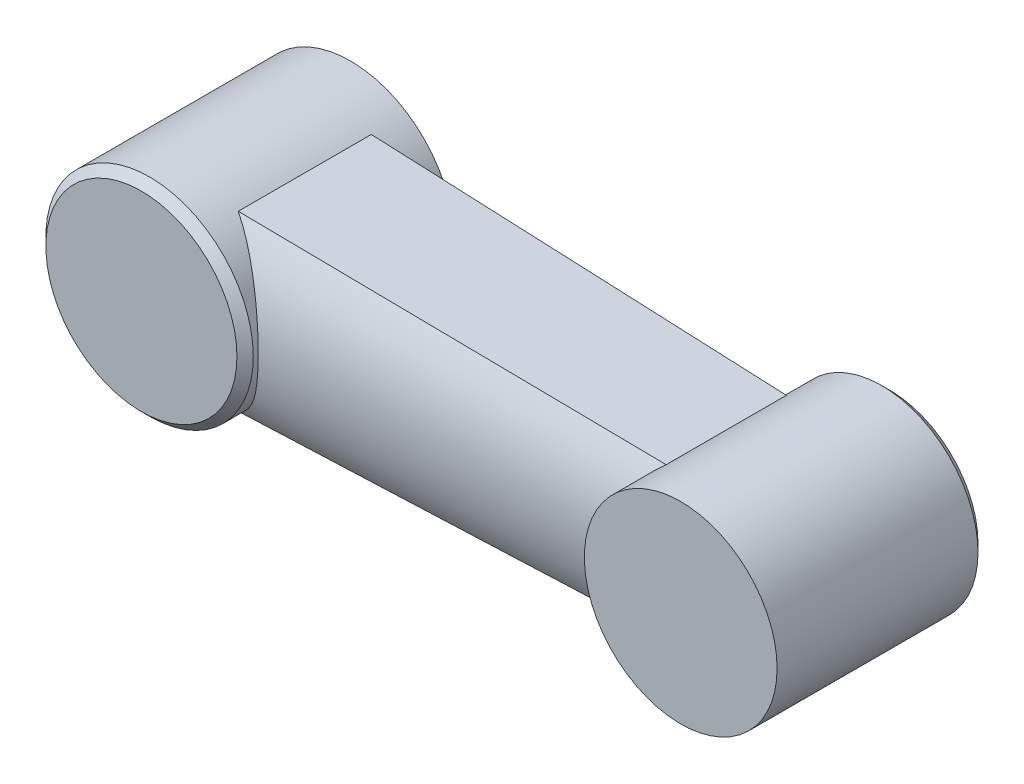
ISO-10303-21;
HEADER;
FILE_DESCRIPTION(('STEP AP214'),'2;1');
FILE_NAME('part.step','',(''),(''),'','','');
FILE_SCHEMA(('AUTOMOTIVE_DESIGN { 1 0 10303 214 1 1 1 1 }'));
ENDSEC;
DATA;
#1=APPLICATION_CONTEXT('core data for automotive mechanical design processes');
#2=APPLICATION_PROTOCOL_DEFINITION('international standard','automotive_design',2000,#1);
#3=PRODUCT_CONTEXT('',#1,'mechanical');
#4=PRODUCT('Part','Part','',(#3));
#5=PRODUCT_RELATED_PRODUCT_CATEGORY('part','',(#4));
#6=PRODUCT_DEFINITION_FORMATION('','',#4);
#7=PRODUCT_DEFINITION_CONTEXT('part definition',#1,'design');
#8=PRODUCT_DEFINITION('design','',#6,#7);
#9=PRODUCT_DEFINITION_SHAPE('','',#8);
#10=(LENGTH_UNIT() NAMED_UNIT(*) SI_UNIT(.MILLI.,.METRE.));
#11=(NAMED_UNIT(*) PLANE_ANGLE_UNIT() SI_UNIT($,.RADIAN.));
#12=(NAMED_UNIT(*) SI_UNIT($,.STERADIAN.) SOLID_ANGLE_UNIT());
#13=UNCERTAINTY_MEASURE_WITH_UNIT(LENGTH_MEASURE(1.E-05),#10,'distance_accuracy_value','');
#14=(GEOMETRIC_REPRESENTATION_CONTEXT(3) GLOBAL_UNCERTAINTY_ASSIGNED_CONTEXT((#13)) GLOBAL_UNIT_ASSIGNED_CONTEXT((#10,
#11,#12)) REPRESENTATION_CONTEXT('',''));
#15=CARTESIAN_POINT('',(0.,0.,0.));
#16=DIRECTION('',(0.,0.,1.));
#17=DIRECTION('',(1.,0.,0.));
#18=AXIS2_PLACEMENT_3D('',#15,#16,#17);
#19=CARTESIAN_POINT('',(0.,0.,-64.));
#20=DIRECTION('',(0.,0.,1.));
#21=DIRECTION('',(1.,0.,0.));
#22=AXIS2_PLACEMENT_3D('',#19,#20,#21);
#23=CYLINDRICAL_SURFACE('',#22,63.5);
#24=CARTESIAN_POINT('',(34.9204791441298,53.035932501884,39.6136534289983));
#25=CARTESIAN_POINT('',(35.6944022457321,52.5263366120522,39.9545585117256));
#26=CARTESIAN_POINT('',(36.4558374355792,52.0007202673648,40.2997799657224));
#27=CARTESIAN_POINT('',(37.953384225097,50.9180230792784,40.9961941182719));
#28=CARTESIAN_POINT('',(38.6894919975638,50.3609375139006,41.3473877073922));
#29=CARTESIAN_POINT('',(40.1358923948207,49.2159612898165,42.0530240157247));
#30=CARTESIAN_POINT('',(40.8461818183182,48.628066832943,42.4074671310783));
#31=CARTESIAN_POINT('',(42.240351755626,47.4220655910807,43.1170402718943));
#32=CARTESIAN_POINT('',(42.9242308312267,46.8039571648921,43.4721703336623));
#33=CARTESIAN_POINT('',(44.2705186839855,45.5327945422843,44.1836196254836));
#34=CARTESIAN_POINT('',(44.9327005849215,44.8794917065392,44.5399240364318));
#35=CARTESIAN_POINT('',(46.2287747746625,43.5432735197613,45.2483179196666));
#36=CARTESIAN_POINT('',(46.8626683351594,42.860359502615,45.6004075809039));
#37=CARTESIAN_POINT('',(48.1013303513337,41.4654310568329,46.2980545066389));
#38=CARTESIAN_POINT('',(48.7060998613074,40.7534176833272,46.6436120073264));
#39=CARTESIAN_POINT('',(49.885582013095,39.3008155912695,47.3259513315572));
#40=CARTESIAN_POINT('',(50.4602931550173,38.5602254499549,47.6627327167584));
#41=CARTESIAN_POINT('',(51.7671230565499,36.7966293591359,48.4370135587281));
#42=CARTESIAN_POINT('',(52.486987566771,35.7625868200861,48.8701899213013));
#43=CARTESIAN_POINT('',(53.8680932645317,33.6463231365426,49.711666019401));
#44=CARTESIAN_POINT('',(54.5293339527788,32.5641015818316,50.1199655430449));
#45=CARTESIAN_POINT('',(55.7900387408964,30.353590750785,50.9066600369545));
#46=CARTESIAN_POINT('',(56.3894987760518,29.2252984501412,51.2850530392084));
#47=CARTESIAN_POINT('',(57.5212239539998,26.9293742529238,52.005760078356));
#48=CARTESIAN_POINT('',(58.0537080044097,25.7618872014115,52.3481910158109));
#49=CARTESIAN_POINT('',(59.0502568765956,23.3874913211638,52.993732445992));
#50=CARTESIAN_POINT('',(59.5143241532075,22.1805839087541,53.2968443494624));
#51=CARTESIAN_POINT('',(60.3704572756633,19.7316956988067,53.8593314616049));
#52=CARTESIAN_POINT('',(60.7625356875299,18.4897210661835,54.1187143027597));
#53=CARTESIAN_POINT('',(61.4302684005686,16.1215713110488,54.5624820901163));
#54=CARTESIAN_POINT('',(61.714153826132,14.9986872151662,54.7520775462024));
#55=CARTESIAN_POINT('',(62.2210427924515,12.7333707527781,55.0916679595512));
#56=CARTESIAN_POINT('',(62.4440498101163,11.5909395066181,55.241665178346));
#57=CARTESIAN_POINT('',(62.8274387168705,9.29097042119799,55.5001048771278));
#58=CARTESIAN_POINT('',(62.9878218290603,8.13343287743358,55.6085481686991));
#59=CARTESIAN_POINT('',(63.2446042459299,5.80839653609666,55.7823981588399));
#60=CARTESIAN_POINT('',(63.341022429846,4.64090078082276,55.8478175558541));
#61=CARTESIAN_POINT('',(63.4691268611473,2.30071551524612,55.9347730550513));
#62=CARTESIAN_POINT('',(63.5008115314218,1.12802587910176,55.9563080880742));
#63=CARTESIAN_POINT('',(63.4991571937612,-1.21715470496937,55.9551835401746));
#64=CARTESIAN_POINT('',(63.4658294096803,-2.38964565224898,55.9325315877641));
#65=CARTESIAN_POINT('',(63.3579910495677,-4.31063448574564,55.8593378030233));
#66=CARTESIAN_POINT('',(63.3024765228745,-5.06077085070067,55.8216709555316));
#67=CARTESIAN_POINT('',(63.1649675931491,-6.55755857953637,55.7284742618857));
#68=CARTESIAN_POINT('',(63.0829720507967,-7.30420979206931,55.6729436471606));
#69=CARTESIAN_POINT('',(62.892804603503,-8.79248851370951,55.5443429087866));
#70=CARTESIAN_POINT('',(62.7846379067425,-9.53411699221496,55.4712762749101));
#71=CARTESIAN_POINT('',(62.54247530455,-11.0113130136815,55.3079947423081));
#72=CARTESIAN_POINT('',(62.4084769904823,-11.7468799847706,55.2177782444768));
#73=CARTESIAN_POINT('',(62.1151386735166,-13.2104664689008,55.0207187131386));
#74=CARTESIAN_POINT('',(61.9558060213724,-13.9384881061527,54.9138805026117));
#75=CARTESIAN_POINT('',(61.6122579762266,-15.3861356748058,54.6841148249538));
#76=CARTESIAN_POINT('',(61.4280402933058,-16.1057608269344,54.5611858771862));
#77=CARTESIAN_POINT('',(61.0352910060898,-17.5354711222982,54.2998831761505));
#78=CARTESIAN_POINT('',(60.8267607142465,-18.2455567781921,54.1615102566014));
#79=CARTESIAN_POINT('',(60.3859721307033,-19.655279575356,53.8700097244628));
#80=CARTESIAN_POINT('',(60.1537116811185,-20.3549157597686,53.7168807701158));
#81=CARTESIAN_POINT('',(59.4141343634581,-22.4598782180801,53.2311245547272));
#82=CARTESIAN_POINT('',(58.8705228075032,-23.8476226491448,52.8764751067773));
#83=CARTESIAN_POINT('',(57.6932450802826,-26.5695174503662,52.1160141959357));
#84=CARTESIAN_POINT('',(57.0595784478214,-27.9036675460074,51.7102024710298));
#85=CARTESIAN_POINT('',(55.7069673807711,-30.5147040769169,50.8542788136301));
#86=CARTESIAN_POINT('',(54.9879523552836,-31.7915418899121,50.4041302636645));
#87=CARTESIAN_POINT('',(53.4702179213507,-34.2828502773657,49.4674248747775));
#88=CARTESIAN_POINT('',(52.6714958500793,-35.4973187661565,48.9808668196359));
#89=CARTESIAN_POINT('',(50.8755490257034,-38.0353618794208,47.905218723411));
#90=CARTESIAN_POINT('',(49.8664229791161,-39.3486029834299,47.3115916164971));
#91=CARTESIAN_POINT('',(47.7551658444119,-41.885782567689,46.0987166871643));
#92=CARTESIAN_POINT('',(46.6530142255047,-43.1097012227068,45.4794632244476));
#93=CARTESIAN_POINT('',(44.3622478691862,-45.4635569828643,44.2289109141248));
#94=CARTESIAN_POINT('',(43.1737431880563,-46.593609912694,43.5976281297309));
#95=CARTESIAN_POINT('',(40.7132426976145,-48.7582311812576,42.3358257344886));
#96=CARTESIAN_POINT('',(39.4412873533656,-49.7928452210454,41.7053059025513));
#97=CARTESIAN_POINT('',(37.6067744813492,-51.1703743191839,40.8344472946498));
#98=CARTESIAN_POINT('',(37.0780303012779,-51.5548051345856,40.5876816459704));
#99=CARTESIAN_POINT('',(36.0084380645576,-52.3074504864124,40.0977796111331));
#100=CARTESIAN_POINT('',(35.4676034432465,-52.6756817931097,39.8546396526085));
#101=CARTESIAN_POINT('',(34.9204791441297,-53.0359325018841,39.6136534289983));
#102=B_SPLINE_CURVE_WITH_KNOTS('',3,(#24,#25,#26,#27,#28,#29,#30,#31,#32,#33,#34,#35,#36,#37,
#38,#39,#40,#41,#42,#43,#44,#45,#46,#47,#48,#49,#50,#51,#52,#53,#54,#55,#56,#57,#58,#59,#60,#61,
#62,#63,#64,#65,#66,#67,#68,#69,#70,#71,#72,#73,#74,#75,#76,#77,#78,#79,#80,#81,#82,#83,#84,#85,
#86,#87,#88,#89,#90,#91,#92,#93,#94,#95,#96,#97,#98,#99,#100,#101),.UNSPECIFIED.,.F.,.F.,(4,2,2,
2,2,2,2,2,2,2,2,2,2,2,2,2,2,2,2,2,2,2,2,2,2,2,2,2,2,2,2,2,2,2,2,2,2,2,4),(0.,2.96179130910863,
5.92402822372926,8.88663119048601,11.8493952627805,14.8368909806684,17.8242522612117,
20.8115053172739,23.7989072932561,27.793469546084,31.7880658168843,35.7829247353502,
39.7643672240742,43.7456668214152,47.7262708005809,51.2448532438437,54.7632346905527,
58.2815474167174,61.7988212510133,65.3161807760589,68.8329331122647,71.0917053695323,
73.3505748212544,75.6089951166956,77.8676260975546,80.1256029289095,82.3837876809059,
84.6418505871747,86.9001190118447,91.4911348475269,96.0821741958438,100.677037562874,
105.272054484957,110.544917455854,115.818947208513,121.086369334502,126.351255910028,
128.447262869353,130.541046297104),.UNSPECIFIED.);
#103=CARTESIAN_POINT('',(34.9204791441298,53.035932501884,39.6136534289983));
#104=VERTEX_POINT('',#103);
#105=CARTESIAN_POINT('',(34.9204791441297,-53.0359325018841,39.6136534289983));
#106=VERTEX_POINT('',#105);
#107=EDGE_CURVE('E115',#104,#106,#102,.T.);
#108=ORIENTED_EDGE('',*,*,#107,.F.);
#109=DIRECTION('',(0.,0.,1.));
#110=VECTOR('',#109,1.);
#111=CARTESIAN_POINT('',(34.9204791441298,53.035932501884,-64.));
#112=LINE('',#111,#110);
#113=CARTESIAN_POINT('',(34.9204791441297,53.0359325018841,-41.825259274656));
#114=VERTEX_POINT('',#113);
#115=EDGE_CURVE('E183',#114,#104,#112,.T.);
#116=ORIENTED_EDGE('',*,*,#115,.F.);
#117=CARTESIAN_POINT('',(34.9204791441297,-53.035932501884,-41.825259274656));
#118=CARTESIAN_POINT('',(35.4329511763315,-52.6985014967848,-42.0146265103923));
#119=CARTESIAN_POINT('',(35.9400059412741,-52.3539966326961,-42.2059169937283));
#120=CARTESIAN_POINT('',(36.9431216705551,-51.65104992522,-42.5916559530003));
#121=CARTESIAN_POINT('',(37.4391828222152,-51.2926083195895,-42.7861043750297));
#122=CARTESIAN_POINT('',(38.9106163521529,-50.1967115336154,-43.3731450594031));
#123=CARTESIAN_POINT('',(39.869287476107,-49.4386523173855,-43.7694508442434));
#124=CARTESIAN_POINT('',(41.7402634827423,-47.8695240724582,-44.5664815151574));
#125=CARTESIAN_POINT('',(42.6525659802537,-47.0584523217289,-44.9672066272704));
#126=CARTESIAN_POINT('',(44.434249173147,-45.3801038911354,-45.7702492719736));
#127=CARTESIAN_POINT('',(45.3033521014658,-44.5125301439949,-46.1725626665485));
#128=CARTESIAN_POINT('',(46.9910205462252,-42.7270754120246,-46.9714284568039));
#129=CARTESIAN_POINT('',(47.809587376756,-41.8091957364726,-47.3679810020785));
#130=CARTESIAN_POINT('',(49.3941260572186,-39.9247512784865,-48.1505134947727));
#131=CARTESIAN_POINT('',(50.1600967533087,-38.9581854287925,-48.5364932101365));
#132=CARTESIAN_POINT('',(51.6385028991067,-36.976293658282,-49.293918859258));
#133=CARTESIAN_POINT('',(52.3508329196351,-35.9608778265998,-49.6653355169379));
#134=CARTESIAN_POINT('',(53.7177541937167,-33.8850585460878,-50.388289993315));
#135=CARTESIAN_POINT('',(54.3723455443608,-32.8246551729114,-50.7398278454393));
#136=CARTESIAN_POINT('',(55.6210447515492,-30.6612022380774,-51.4186270461508));
#137=CARTESIAN_POINT('',(56.2151499680016,-29.5581508178194,-51.7458873349047));
#138=CARTESIAN_POINT('',(57.3385901727929,-27.3149369246483,-52.3711276801021));
#139=CARTESIAN_POINT('',(57.8680756050923,-26.1748687889999,-52.669175415835));
#140=CARTESIAN_POINT('',(58.8609392870564,-23.8584909054211,-53.2328643342909));
#141=CARTESIAN_POINT('',(59.324318888847,-22.6821818993585,-53.4985061798264));
#142=CARTESIAN_POINT('',(60.1820146047915,-20.2973045444015,-53.9936461620778));
#143=CARTESIAN_POINT('',(60.5763384611462,-19.0887398293945,-54.2231483503085));
#144=CARTESIAN_POINT('',(61.2631175599457,-16.7464156556383,-54.6250781063024));
#145=CARTESIAN_POINT('',(61.5613448097043,-15.6148908168627,-54.8006792192965));
#146=CARTESIAN_POINT('',(62.0956576965435,-13.3324014775981,-55.1165321485046));
#147=CARTESIAN_POINT('',(62.3317455940635,-12.18143768586,-55.256785250563));
#148=CARTESIAN_POINT('',(62.7401645301272,-9.86436231973461,-55.5000987665018));
#149=CARTESIAN_POINT('',(62.912496367435,-8.69825093531251,-55.6031596463424));
#150=CARTESIAN_POINT('',(63.1921220630998,-6.35582527849701,-55.7706750271059));
#151=CARTESIAN_POINT('',(63.2994346830437,-5.17951404878393,-55.8351406647953));
#152=CARTESIAN_POINT('',(63.4482993720607,-2.82123041034882,-55.9246272398676));
#153=CARTESIAN_POINT('',(63.4898502603072,-1.63925790035429,-55.9496474689633));
#154=CARTESIAN_POINT('',(63.5068605581626,0.725233066483945,-55.9598855690213));
#155=CARTESIAN_POINT('',(63.4823293528247,1.90775142195788,-55.9451090919567));
#156=CARTESIAN_POINT('',(63.3870128437778,3.86564067907278,-55.8877831221473));
#157=CARTESIAN_POINT('',(63.3348569612791,4.64231742820051,-55.8564250116808));
#158=CARTESIAN_POINT('',(63.2021269736853,6.1924274525821,-55.7767263224024));
#159=CARTESIAN_POINT('',(63.1215515415688,6.96586057467139,-55.7283849505749));
#160=CARTESIAN_POINT('',(62.9322579418603,8.50789510120148,-55.6150157170094));
#161=CARTESIAN_POINT('',(62.8235447552623,9.2764973361733,-55.5499908086375));
#162=CARTESIAN_POINT('',(62.5782999556594,10.8077587641072,-55.4036260255602));
#163=CARTESIAN_POINT('',(62.4417657409612,11.5704173943206,-55.3222846250232));
#164=CARTESIAN_POINT('',(62.1413454892623,13.0882199615413,-55.1437868453062));
#165=CARTESIAN_POINT('',(61.9774675491304,13.8433660531843,-55.046635147991));
#166=CARTESIAN_POINT('',(61.6227977195174,15.345234898731,-54.8370418867419));
#167=CARTESIAN_POINT('',(61.4320033326938,16.0919568640828,-54.7245989040978));
#168=CARTESIAN_POINT('',(61.0240541100731,17.5757427244503,-54.4850573243668));
#169=CARTESIAN_POINT('',(60.8069009078113,18.3128072148353,-54.3579596355007));
#170=CARTESIAN_POINT('',(60.3468055732263,19.7762910410918,-54.0897948185494));
#171=CARTESIAN_POINT('',(60.1038610824083,20.5027093964986,-53.9487264129856));
#172=CARTESIAN_POINT('',(59.3312996443074,22.6812353701954,-53.5022294264304));
#173=CARTESIAN_POINT('',(58.7626495863962,24.1155617782149,-53.1762833241771));
#174=CARTESIAN_POINT('',(57.5276404080347,26.929207327166,-52.4770099037482));
#175=CARTESIAN_POINT('',(56.8612808424359,28.3085262174558,-52.1036823697113));
#176=CARTESIAN_POINT('',(55.4354741116142,31.0079034495724,-51.3166110679932));
#177=CARTESIAN_POINT('',(54.6759396827641,32.3279046319016,-50.9028294875325));
#178=CARTESIAN_POINT('',(53.0694785578403,34.9024817137204,-50.0429916139823));
#179=CARTESIAN_POINT('',(52.222549560892,36.1570558893752,-49.5969344712526));
#180=CARTESIAN_POINT('',(50.3344485626476,38.7502071075263,-48.6231369655814));
#181=CARTESIAN_POINT('',(49.2822398779649,40.0795481993903,-48.0921732916076));
#182=CARTESIAN_POINT('',(47.0789760519195,42.645998427888,-47.0117063802052));
#183=CARTESIAN_POINT('',(45.9278979810722,43.8830860444264,-46.4621988601816));
#184=CARTESIAN_POINT('',(43.5344656317634,46.258388891111,-45.3584403884191));
#185=CARTESIAN_POINT('',(42.2922715661926,47.3967703356357,-44.8041992079847));
#186=CARTESIAN_POINT('',(39.7198760460923,49.5723363218903,-43.7036115264448));
#187=CARTESIAN_POINT('',(38.3897259168424,50.6095790220287,-43.1572606439708));
#188=CARTESIAN_POINT('',(36.6734445111944,51.8409898950362,-42.4876410044361));
#189=CARTESIAN_POINT('',(36.32636319544,52.0847914070432,-42.3539511300581));
#190=CARTESIAN_POINT('',(35.627214351749,52.5654961144804,-42.0882885632034));
#191=CARTESIAN_POINT('',(35.2751506116487,52.8024041715919,-41.9563146987061));
#192=CARTESIAN_POINT('',(34.9204791441297,53.0359325018841,-41.825259274656));
#193=B_SPLINE_CURVE_WITH_KNOTS('',3,(#117,#118,#119,#120,#121,#122,#123,#124,#125,#126,#127,
#128,#129,#130,#131,#132,#133,#134,#135,#136,#137,#138,#139,#140,#141,#142,#143,#144,#145,#146,
#147,#148,#149,#150,#151,#152,#153,#154,#155,#156,#157,#158,#159,#160,#161,#162,#163,#164,#165,
#166,#167,#168,#169,#170,#171,#172,#173,#174,#175,#176,#177,#178,#179,#180,#181,#182,#183,#184,
#185,#186,#187,#188,#189,#190,#191,#192),.UNSPECIFIED.,.F.,.F.,(4,2,2,2,2,2,2,2,2,2,2,2,2,2,2,2,
2,2,2,2,2,2,2,2,2,2,2,2,2,2,2,2,2,2,2,2,2,4),(0.,1.92628858364389,3.85254431973241,
7.70487295486725,11.5573995509635,15.4321361283338,19.3067719084512,23.1814926622749,
27.0636403813002,30.9457815721536,34.8280921376872,38.70118435936,42.574197349606,
46.446775837732,49.9943409305591,53.5417769559906,57.0891685360716,60.6355360122918,
64.1819671668526,67.7278946798289,70.0644210529674,72.4010565422384,74.7372786788104,
77.0737193883799,79.4094694682382,81.7454364046878,84.0812586480562,86.4172946759219,
91.1429218605175,95.8685705749714,100.598679414114,105.328912816658,110.653168394873,
115.978662109452,121.2950064619,126.608275470235,127.942389826,129.275539282724),.UNSPECIFIED.);
#194=CARTESIAN_POINT('',(34.9204791441297,-53.035932501884,-41.825259274656));
#195=VERTEX_POINT('',#194);
#196=EDGE_CURVE('E100',#195,#114,#193,.T.);
#197=ORIENTED_EDGE('',*,*,#196,.F.);
#198=DIRECTION('',(0.,0.,1.));
#199=VECTOR('',#198,1.);
#200=CARTESIAN_POINT('',(34.9204791441297,-53.0359325018841,-64.));
#201=LINE('',#200,#199);
#202=EDGE_CURVE('E119',#106,#195,#201,.F.);
#203=ORIENTED_EDGE('',*,*,#202,.F.);
#204=EDGE_LOOP('',(#108,#116,#197,#203));
#205=FACE_BOUND('',#204,.T.);
#206=CARTESIAN_POINT('',(0.,0.,59.));
#207=DIRECTION('',(0.,0.,1.));
#208=DIRECTION('',(1.,0.,0.));
#209=AXIS2_PLACEMENT_3D('',#206,#207,#208);
#210=CIRCLE('',#209,63.5);
#211=CARTESIAN_POINT('',(63.5,0.,59.));
#212=VERTEX_POINT('',#211);
#213=EDGE_CURVE('E175',#212,#212,#210,.F.);
#214=ORIENTED_EDGE('',*,*,#213,.T.);
#215=EDGE_LOOP('',(#214));
#216=FACE_BOUND('',#215,.T.);
#217=CARTESIAN_POINT('',(0.,0.,-64.));
#218=DIRECTION('',(0.,0.,1.));
#219=DIRECTION('',(1.,0.,0.));
#220=AXIS2_PLACEMENT_3D('',#217,#218,#219);
#221=CIRCLE('',#220,63.5);
#222=CARTESIAN_POINT('',(63.5,0.,-64.));
#223=VERTEX_POINT('',#222);
#224=EDGE_CURVE('E103',#223,#223,#221,.T.);
#225=ORIENTED_EDGE('',*,*,#224,.T.);
#226=EDGE_LOOP('',(#225));
#227=FACE_BOUND('',#226,.T.);
#228=ADVANCED_FACE('F50',(#205,#216,#227),#23,.T.);
#229=CARTESIAN_POINT('',(0.,0.,-64.));
#230=DIRECTION('',(0.,0.,1.));
#231=DIRECTION('',(1.,0.,0.));
#232=AXIS2_PLACEMENT_3D('',#229,#230,#231);
#233=PLANE('',#232);
#234=ORIENTED_EDGE('',*,*,#224,.F.);
#235=EDGE_LOOP('',(#234));
#236=FACE_BOUND('',#235,.T.);
#237=ADVANCED_FACE('F187',(#236),#233,.F.);
#238=CARTESIAN_POINT('',(0.,0.,64.));
#239=DIRECTION('',(0.,0.,1.));
#240=DIRECTION('',(1.,0.,0.));
#241=AXIS2_PLACEMENT_3D('',#238,#239,#240);
#242=PLANE('',#241);
#243=CARTESIAN_POINT('',(0.,0.,64.));
#244=DIRECTION('',(0.,0.,1.));
#245=DIRECTION('',(1.,0.,0.));
#246=AXIS2_PLACEMENT_3D('',#243,#244,#245);
#247=CIRCLE('',#246,58.5);
#248=CARTESIAN_POINT('',(58.5,0.,64.));
#249=VERTEX_POINT('',#248);
#250=EDGE_CURVE('E172',#249,#249,#247,.T.);
#251=ORIENTED_EDGE('',*,*,#250,.T.);
#252=EDGE_LOOP('',(#251));
#253=FACE_BOUND('',#252,.T.);
#254=ADVANCED_FACE('F195',(#253),#242,.T.);
#255=CARTESIAN_POINT('',(0.,0.,64.));
#256=DIRECTION('',(0.,0.,-1.));
#257=DIRECTION('',(-1.,0.,0.));
#258=AXIS2_PLACEMENT_3D('',#255,#256,#257);
#259=CONICAL_SURFACE('',#258,58.5,0.785398163397448);
#260=ORIENTED_EDGE('',*,*,#213,.F.);
#261=EDGE_LOOP('',(#260));
#262=FACE_BOUND('',#261,.T.);
#263=ORIENTED_EDGE('',*,*,#250,.F.);
#264=EDGE_LOOP('',(#263));
#265=FACE_BOUND('',#264,.T.);
#266=ADVANCED_FACE('F190',(#262,#265),#259,.T.);
#267=CARTESIAN_POINT('',(0.,54.,40.1203836734958));
#268=CARTESIAN_POINT('',(330.2,44.884,35.3288593063052));
#269=CARTESIAN_POINT('',(0.,20.639458431767,64.4313532901268));
#270=CARTESIAN_POINT('',(330.2,16.7556671843076,53.5444137632735));
#271=CARTESIAN_POINT('',(0.,-20.639458431767,64.4313532901268));
#272=CARTESIAN_POINT('',(330.2,-16.7556671843077,53.5444137632735));
#273=CARTESIAN_POINT('',(0.,-54.,40.1203836734958));
#274=CARTESIAN_POINT('',(330.2,-44.884,35.3288593063052));
#275=(BOUNDED_SURFACE() B_SPLINE_SURFACE(3,1,((#267,#268),(#269,#270),(#271,#272),(#273,#274)),
.UNSPECIFIED.,.F.,.F.,.F.) B_SPLINE_SURFACE_WITH_KNOTS((4,4),(2,2),(0.,1.),(0.,1.),
.UNSPECIFIED.) GEOMETRIC_REPRESENTATION_ITEM() RATIONAL_B_SPLINE_SURFACE(((1.,1.),
(0.87211590650535,0.892911823132011),(0.87211590650535,0.892911823132011),(1.,1.))) REPRESENTATION_ITEM('') SURFACE());
#276=CARTESIAN_POINT('',(293.13880744519,45.9071672662921,35.8666533923243));
#277=CARTESIAN_POINT('',(292.712519107393,45.5630168007029,36.1070183437613));
#278=CARTESIAN_POINT('',(292.291029785763,45.2129424445899,36.3473464336468));
#279=CARTESIAN_POINT('',(291.457756712528,44.5009999987006,36.8273736680498));
#280=CARTESIAN_POINT('',(291.045973061452,44.1391317868603,37.0670728060301));
#281=CARTESIAN_POINT('',(289.824682922425,43.0353208706365,37.7847814342897));
#282=CARTESIAN_POINT('',(289.029941805426,42.2757405525025,38.2610032426371));
#283=CARTESIAN_POINT('',(287.481219240747,40.7101781273798,39.2042541884323));
#284=CARTESIAN_POINT('',(286.727251174264,39.9041809640321,39.6712802763675));
#285=CARTESIAN_POINT('',(285.257398966099,38.2413624717338,40.5946277713315));
#286=CARTESIAN_POINT('',(284.541791243822,37.3842473565594,41.0508609097362));
#287=CARTESIAN_POINT('',(283.156327186116,35.6250750174494,41.9449942404234));
#288=CARTESIAN_POINT('',(282.486457912795,34.7230306284233,42.3828996033475));
#289=CARTESIAN_POINT('',(281.194918630932,32.875104529025,43.2361068614287));
#290=CARTESIAN_POINT('',(280.573239515952,31.9292311552053,43.6514130226877));
#291=CARTESIAN_POINT('',(279.219212109827,29.7328790012934,44.5641202293815));
#292=CARTESIAN_POINT('',(278.502483924526,28.4692764210259,45.0532971050887));
#293=CARTESIAN_POINT('',(277.157578061997,25.8772541491496,45.9796573399789));
#294=CARTESIAN_POINT('',(276.52939669685,24.5488371601241,46.4168428644505));
#295=CARTESIAN_POINT('',(275.659491368916,22.5139056400943,47.0266789890247));
#296=CARTESIAN_POINT('',(275.381847311635,21.8293130047438,47.2221126472426));
#297=CARTESIAN_POINT('',(274.851155821966,20.4463632344197,47.5969195143945));
#298=CARTESIAN_POINT('',(274.598105911889,19.7480074945267,47.7762943410003));
#299=CARTESIAN_POINT('',(274.117409833995,18.338420231129,48.1180362441837));
#300=CARTESIAN_POINT('',(273.889766257183,17.6271874029647,48.2804015859847));
#301=CARTESIAN_POINT('',(273.460738165769,16.1930957089545,48.5871795261138));
#302=CARTESIAN_POINT('',(273.259351689195,15.4702377162983,48.7315934657609));
#303=CARTESIAN_POINT('',(272.819056671129,13.7639921581783,49.0480055656246));
#304=CARTESIAN_POINT('',(272.591004360321,12.7763645691658,49.2124512446797));
#305=CARTESIAN_POINT('',(272.185311398445,10.785546272069,49.5056170994964));
#306=CARTESIAN_POINT('',(272.007672548735,9.78235500921881,49.6343359986761));
#307=CARTESIAN_POINT('',(271.704187059931,7.76409454652384,49.854572025615));
#308=CARTESIAN_POINT('',(271.578340440395,6.74902534219387,49.9460891393262));
#309=CARTESIAN_POINT('',(271.379458847949,4.71088268572484,50.0908413140661));
#310=CARTESIAN_POINT('',(271.306429802869,3.68780834817292,50.1440720781311));
#311=CARTESIAN_POINT('',(271.213817145936,1.63796113523577,50.2115927737624));
#312=CARTESIAN_POINT('',(271.19423394593,0.611188231410945,50.2258824052539));
#313=CARTESIAN_POINT('',(271.208688695195,-1.44169099436527,50.2153387970439));
#314=CARTESIAN_POINT('',(271.242719286827,-2.46779738845241,50.1905109255976));
#315=CARTESIAN_POINT('',(271.34370604089,-4.17146032353645,50.1169109171884));
#316=CARTESIAN_POINT('',(271.395780233053,-4.85042636544303,50.0789703167845));
#317=CARTESIAN_POINT('',(271.523258551791,-6.20505878693228,49.9861733691574));
#318=CARTESIAN_POINT('',(271.5986637947,-6.88072500705473,49.9313162125181));
#319=CARTESIAN_POINT('',(271.772516571097,-8.22739780906378,49.8049844981628));
#320=CARTESIAN_POINT('',(271.870960216517,-8.89840515754983,49.7335127444165));
#321=CARTESIAN_POINT('',(272.090557899801,-10.2348103753804,49.5743098394126));
#322=CARTESIAN_POINT('',(272.211714047972,-10.9002077174693,49.4865771772994));
#323=CARTESIAN_POINT('',(272.476260169144,-12.2239590645947,49.2953406635122));
#324=CARTESIAN_POINT('',(272.619639787395,-12.8823161979814,49.1918441571918));
#325=CARTESIAN_POINT('',(272.928200765172,-14.1913143361326,48.9695619126879));
#326=CARTESIAN_POINT('',(273.093384111985,-14.8419546316523,48.8507747808743));
#327=CARTESIAN_POINT('',(273.620867618725,-16.7807907382839,48.4723179534203));
#328=CARTESIAN_POINT('',(274.015156937472,-18.056179207113,48.1905124127515));
#329=CARTESIAN_POINT('',(274.893586765092,-20.5922438648863,47.5665031871302));
#330=CARTESIAN_POINT('',(275.379462217577,-21.8520280528024,47.2231408751309));
#331=CARTESIAN_POINT('',(276.430177376727,-24.3230044535086,46.4862603180744));
#332=CARTESIAN_POINT('',(276.99501826799,-25.5341959369856,46.0927413206007));
#333=CARTESIAN_POINT('',(278.199409536701,-27.9053735236703,45.261298830561));
#334=CARTESIAN_POINT('',(278.839071401853,-29.0652795719636,44.8233092056184));
#335=CARTESIAN_POINT('',(280.187567127682,-31.328772984378,43.9099458072107));
#336=CARTESIAN_POINT('',(280.896401933481,-32.4323595786824,43.4345715229695));
#337=CARTESIAN_POINT('',(282.181770397949,-34.2953098579103,42.5835180946852));
#338=CARTESIAN_POINT('',(282.743437508217,-35.0682463165031,42.2148957623656));
#339=CARTESIAN_POINT('',(283.900133836585,-36.5818205768069,41.4636841420771));
#340=CARTESIAN_POINT('',(284.495165641857,-37.3224558658754,41.0810937718006));
#341=CARTESIAN_POINT('',(285.717200140536,-38.7708462984485,40.3045912896642));
#342=CARTESIAN_POINT('',(286.344207307045,-39.4785968150203,39.9106775971426));
#343=CARTESIAN_POINT('',(287.62618786977,-40.8577176780909,39.115942820759));
#344=CARTESIAN_POINT('',(288.281032493839,-41.5292285687372,38.7151577745425));
#345=CARTESIAN_POINT('',(289.619973176203,-42.8385136938941,37.9078426810643));
#346=CARTESIAN_POINT('',(290.304064395962,-43.4762934700991,37.5013135914867));
#347=CARTESIAN_POINT('',(291.700438216683,-44.7175044426955,36.6854406423143));
#348=CARTESIAN_POINT('',(292.412707412545,-45.3209516467567,36.2760981959111));
#349=CARTESIAN_POINT('',(293.13880744519,-45.9071672662921,35.8666533923243));
#350=B_SPLINE_CURVE_WITH_KNOTS('',3,(#276,#277,#278,#279,#280,#281,#282,#283,#284,#285,#286,
#287,#288,#289,#290,#291,#292,#293,#294,#295,#296,#297,#298,#299,#300,#301,#302,#303,#304,#305,
#306,#307,#308,#309,#310,#311,#312,#313,#314,#315,#316,#317,#318,#319,#320,#321,#322,#323,#324,
#325,#326,#327,#328,#329,#330,#331,#332,#333,#334,#335,#336,#337,#338,#339,#340,#341,#342,#343,
#344,#345,#346,#347,#348,#349),.UNSPECIFIED.,.F.,.F.,(4,2,2,2,2,2,2,2,2,2,2,2,2,2,2,2,2,2,2,2,2,
2,2,2,2,2,2,2,2,2,2,2,2,2,2,2,4),(0.,1.79473172473934,3.58948203047687,7.18194730854547,
10.7755845207562,14.3923564223259,18.0081009840017,21.6231606086267,26.217177548167,
30.8110030932191,33.1029267387422,35.394619249023,37.6865452591332,39.9782999147002,
43.0568861498267,46.1355823741998,49.2142797611402,52.2933226233694,55.3723892122132,
58.4510332849543,60.4965190203061,62.5421026423694,64.5873412909291,66.6327700648232,
68.6772486458637,70.7219136984829,74.8103887814974,78.9859482933144,83.161570451411,
87.343495755581,91.5254782061465,94.5966894037717,97.6681390801192,100.740019613052,
103.798974811937,106.857425883044,109.914439054138),.UNSPECIFIED.);
#351=CARTESIAN_POINT('',(293.13880744519,45.9071672662921,35.8666533923243));
#352=VERTEX_POINT('',#351);
#353=CARTESIAN_POINT('',(293.13880744519,-45.9071672662921,35.8666533923243));
#354=VERTEX_POINT('',#353);
#355=EDGE_CURVE('E73',#352,#354,#350,.T.);
#356=DIRECTION('',(-0.999513983011482,0.0275940928804744,0.0145039236975991));
#357=VECTOR('',#356,1.);
#358=CARTESIAN_POINT('',(165.1,49.442,37.7246214899005));
#359=LINE('',#358,#357);
#360=EDGE_CURVE('E109',#352,#104,#359,.T.);
#361=DIRECTION('',(0.999513983011482,0.0275940928804744,-0.0145039236975991));
#362=VECTOR('',#361,1.);
#363=CARTESIAN_POINT('',(165.1,-49.442,37.7246214899005));
#364=LINE('',#363,#362);
#365=EDGE_CURVE('E168',#106,#354,#364,.T.);
#366=ORIENTED_EDGE('',*,*,#355,.F.);
#367=ORIENTED_EDGE('',*,*,#360,.T.);
#368=ORIENTED_EDGE('',*,*,#107,.T.);
#369=ORIENTED_EDGE('',*,*,#365,.T.);
#370=EDGE_LOOP('',(#366,#367,#368,#369));
#371=FACE_BOUND('',#370,.T.);
#372=ADVANCED_FACE('F147',(#371),#275,.T.);
#373=CARTESIAN_POINT('',(1.48967018354227,-53.9588739146179,0.));
#374=DIRECTION('',(0.0275969957376287,-0.999619130382296,0.));
#375=DIRECTION('',(0.999619130382296,0.0275969957376287,0.));
#376=AXIS2_PLACEMENT_3D('',#373,#374,#375);
#377=PLANE('',#376);
#378=DIRECTION('',(0.,0.,1.));
#379=VECTOR('',#378,1.);
#380=CARTESIAN_POINT('',(293.13880744519,-45.9071672662921,-64.));
#381=LINE('',#380,#379);
#382=CARTESIAN_POINT('',(293.13880744519,-45.9071672662921,-37.7260843859217));
#383=VERTEX_POINT('',#382);
#384=EDGE_CURVE('E66',#354,#383,#381,.F.);
#385=ORIENTED_EDGE('',*,*,#384,.F.);
#386=ORIENTED_EDGE('',*,*,#365,.F.);
#387=ORIENTED_EDGE('',*,*,#202,.T.);
#388=DIRECTION('',(0.999493292780532,0.0275935216747042,0.0158667970402448));
#389=VECTOR('',#388,1.);
#390=CARTESIAN_POINT('',(0.,-54.,-42.3796163265043));
#391=LINE('',#390,#389);
#392=EDGE_CURVE('E104',#195,#383,#391,.T.);
#393=ORIENTED_EDGE('',*,*,#392,.T.);
#394=EDGE_LOOP('',(#385,#386,#387,#393));
#395=FACE_BOUND('',#394,.T.);
#396=ADVANCED_FACE('F201',(#395),#377,.T.);
#397=CARTESIAN_POINT('',(1.48967018354226,53.9588739146179,0.));
#398=DIRECTION('',(0.0275969957376287,0.999619130382296,0.));
#399=DIRECTION('',(-0.999619130382296,0.0275969957376287,0.));
#400=AXIS2_PLACEMENT_3D('',#397,#398,#399);
#401=PLANE('',#400);
#402=DIRECTION('',(0.,0.,1.));
#403=VECTOR('',#402,1.);
#404=CARTESIAN_POINT('',(293.13880744519,45.9071672662921,-64.));
#405=LINE('',#404,#403);
#406=CARTESIAN_POINT('',(293.13880744519,45.9071672662921,-37.7260843859217));
#407=VERTEX_POINT('',#406);
#408=EDGE_CURVE('E107',#407,#352,#405,.T.);
#409=ORIENTED_EDGE('',*,*,#408,.F.);
#410=DIRECTION('',(0.999493292780532,-0.0275935216747042,0.0158667970402448));
#411=VECTOR('',#410,1.);
#412=CARTESIAN_POINT('',(165.1,49.442,-39.758680087846));
#413=LINE('',#412,#411);
#414=EDGE_CURVE('E94',#114,#407,#413,.T.);
#415=ORIENTED_EDGE('',*,*,#414,.F.);
#416=ORIENTED_EDGE('',*,*,#115,.T.);
#417=ORIENTED_EDGE('',*,*,#360,.F.);
#418=EDGE_LOOP('',(#409,#415,#416,#417));
#419=FACE_BOUND('',#418,.T.);
#420=ADVANCED_FACE('F108',(#419),#401,.T.);
#421=CARTESIAN_POINT('',(0.,-54.,-42.3796163265043));
#422=CARTESIAN_POINT('',(330.2,-44.884,-37.1377438491877));
#423=CARTESIAN_POINT('',(0.,-19.987417175028,-63.382749209216));
#424=CARTESIAN_POINT('',(330.2,-16.2895105188567,-52.750167847035));
#425=CARTESIAN_POINT('',(0.,19.9874171750281,-63.382749209216));
#426=CARTESIAN_POINT('',(330.2,16.2895105188567,-52.750167847035));
#427=CARTESIAN_POINT('',(0.,54.,-42.3796163265043));
#428=CARTESIAN_POINT('',(330.2,44.884,-37.1377438491877));
#429=(BOUNDED_SURFACE() B_SPLINE_SURFACE(3,1,((#421,#422),(#423,#424),(#425,#426),(#427,#428)),
.UNSPECIFIED.,.F.,.F.,.F.) B_SPLINE_SURFACE_WITH_KNOTS((4,4),(2,2),(0.,1.),(0.,1.),
.UNSPECIFIED.) GEOMETRIC_REPRESENTATION_ITEM() RATIONAL_B_SPLINE_SURFACE(((1.,1.),
(0.900566583584842,0.918464266683405),(0.900566583584842,0.918464266683405),(1.,1.))) REPRESENTATION_ITEM('') SURFACE());
#430=CARTESIAN_POINT('',(293.13880744519,-45.9071672662921,-37.7260843859218));
#431=CARTESIAN_POINT('',(292.496720089196,-45.3887938659038,-38.0339193267897));
#432=CARTESIAN_POINT('',(291.865635406321,-44.8570746413022,-38.3422385912424));
#433=CARTESIAN_POINT('',(290.625806155285,-43.7671687827326,-38.9582153040598));
#434=CARTESIAN_POINT('',(290.017072417387,-43.2089696103509,-39.2658723653179));
#435=CARTESIAN_POINT('',(288.822738769032,-42.0666752168509,-39.8786766258025));
#436=CARTESIAN_POINT('',(288.237144964839,-41.482573245556,-40.1838231459375));
#437=CARTESIAN_POINT('',(287.089926771456,-40.2890408796732,-40.7898230300207));
#438=CARTESIAN_POINT('',(286.528304282361,-39.6796084847885,-41.0906760523895));
#439=CARTESIAN_POINT('',(285.425506376592,-38.4310286519547,-41.688727884127));
#440=CARTESIAN_POINT('',(284.884528028345,-37.7916841673898,-41.9858789096644));
#441=CARTESIAN_POINT('',(283.828694728932,-36.4884267564069,-42.5723329277075));
#442=CARTESIAN_POINT('',(283.313836856355,-35.8245165919327,-42.8616367961765));
#443=CARTESIAN_POINT('',(282.311166342377,-34.4727093941035,-43.4307267225721));
#444=CARTESIAN_POINT('',(281.823351339667,-33.784814463602,-43.7105136106678));
#445=CARTESIAN_POINT('',(280.875732578356,-32.3856547560431,-44.2589396805297));
#446=CARTESIAN_POINT('',(280.415929929017,-31.6743890552396,-44.5275784207055));
#447=CARTESIAN_POINT('',(279.374499684969,-29.9843246773255,-45.1409583113732));
#448=CARTESIAN_POINT('',(278.804388976841,-28.9965429336338,-45.4806401478968));
#449=CARTESIAN_POINT('',(277.719085885065,-26.9826275250427,-46.1332224697688));
#450=CARTESIAN_POINT('',(277.203896191695,-25.9564919847233,-46.4461216430335));
#451=CARTESIAN_POINT('',(276.231283827237,-23.8684745120896,-47.0414199411512));
#452=CARTESIAN_POINT('',(275.773864345629,-22.8065906102115,-47.3238173818852));
#453=CARTESIAN_POINT('',(274.921204307743,-20.6540588875455,-47.8536169715647));
#454=CARTESIAN_POINT('',(274.525754560575,-19.5635230135295,-48.1011365591166));
#455=CARTESIAN_POINT('',(273.797939673725,-17.3539753567216,-48.5590591606354));
#456=CARTESIAN_POINT('',(273.465572477651,-16.2349645035186,-48.7694633844894));
#457=CARTESIAN_POINT('',(272.866542993504,-13.9729437197973,-49.1502107246396));
#458=CARTESIAN_POINT('',(272.599869178099,-12.8299380379478,-49.3205608690569));
#459=CARTESIAN_POINT('',(272.162090547971,-10.6618294110008,-49.601036170373));
#460=CARTESIAN_POINT('',(271.983392532605,-9.63886707784126,-49.7159138455618));
#461=CARTESIAN_POINT('',(271.679937042149,-7.58175364405776,-49.9113471523859));
#462=CARTESIAN_POINT('',(271.555176173951,-6.54760325145518,-49.9919049430315));
#463=CARTESIAN_POINT('',(271.360495808749,-4.47204603166578,-50.1177357547125));
#464=CARTESIAN_POINT('',(271.29057461732,-3.43063942968311,-50.1630098659363));
#465=CARTESIAN_POINT('',(271.206082247739,-1.34447079064766,-50.2177301741855));
#466=CARTESIAN_POINT('',(271.191519738635,-0.299708253698897,-50.2271707597588));
#467=CARTESIAN_POINT('',(271.217876860571,1.78883857780831,-50.2100939697318));
#468=CARTESIAN_POINT('',(271.258798151785,2.8326228421599,-50.1835755181724));
#469=CARTESIAN_POINT('',(271.395820573489,4.9149695916452,-50.0949009566609));
#470=CARTESIAN_POINT('',(271.491915638918,5.95353263807286,-50.0327487638023));
#471=CARTESIAN_POINT('',(271.698030331098,7.68171326976662,-49.8997296110453));
#472=CARTESIAN_POINT('',(271.793110423541,8.37390531209063,-49.8384295295109));
#473=CARTESIAN_POINT('',(272.007515055979,9.75303214095698,-49.7004384844756));
#474=CARTESIAN_POINT('',(272.126840763506,10.4399666726737,-49.6237467798033));
#475=CARTESIAN_POINT('',(272.389340772888,11.8072942444694,-49.4553893095602));
#476=CARTESIAN_POINT('',(272.532511113314,12.4876883513147,-49.3637260313404));
#477=CARTESIAN_POINT('',(272.8422766503,13.8410136677952,-49.1658935996035));
#478=CARTESIAN_POINT('',(273.008873943409,14.5139442036708,-49.0597231478188));
#479=CARTESIAN_POINT('',(273.543038248134,16.5197495310545,-48.7202717853114));
#480=CARTESIAN_POINT('',(273.945071246132,17.8401234860976,-48.4659905586214));
#481=CARTESIAN_POINT('',(274.836571174007,20.4396655842357,-47.9064184167488));
#482=CARTESIAN_POINT('',(275.326042094799,21.7188318433473,-47.6011251732735));
#483=CARTESIAN_POINT('',(276.413400841231,24.2908153579209,-46.9292206668388));
#484=CARTESIAN_POINT('',(277.015378462332,25.5813165253976,-46.56036248915));
#485=CARTESIAN_POINT('',(278.304870362698,28.1052357299467,-45.7795416536391));
#486=CARTESIAN_POINT('',(278.992390282917,29.338649995145,-45.3675761534559));
#487=CARTESIAN_POINT('',(280.448076203327,31.7446750088677,-44.5075405520314));
#488=CARTESIAN_POINT('',(281.21628806269,32.9172506096267,-44.0594499540222));
#489=CARTESIAN_POINT('',(282.828100471346,35.1973303481341,-43.1348401849473));
#490=CARTESIAN_POINT('',(283.671691979184,36.304842263642,-42.6583244256271));
#491=CARTESIAN_POINT('',(285.19514997058,38.1654069608548,-41.8144975234692));
#492=CARTESIAN_POINT('',(285.858615699108,38.9341662960258,-41.4519871974162));
#493=CARTESIAN_POINT('',(287.222158051074,40.4342954956751,-40.7188597171099));
#494=CARTESIAN_POINT('',(287.922230197022,41.165669911325,-40.3482435575272));
#495=CARTESIAN_POINT('',(289.35544338689,42.5880097655902,-39.603144950124));
#496=CARTESIAN_POINT('',(290.088475773878,43.2790928828136,-39.2286779531954));
#497=CARTESIAN_POINT('',(291.588484901481,44.6224604561868,-38.4779331362613));
#498=CARTESIAN_POINT('',(292.355463866071,45.2747423637338,-38.1016551990575));
#499=CARTESIAN_POINT('',(293.13880744519,45.9071672662921,-37.7260843859217));
#500=B_SPLINE_CURVE_WITH_KNOTS('',3,(#430,#431,#432,#433,#434,#435,#436,#437,#438,#439,#440,
#441,#442,#443,#444,#445,#446,#447,#448,#449,#450,#451,#452,#453,#454,#455,#456,#457,#458,#459,
#460,#461,#462,#463,#464,#465,#466,#467,#468,#469,#470,#471,#472,#473,#474,#475,#476,#477,#478,
#479,#480,#481,#482,#483,#484,#485,#486,#487,#488,#489,#490,#491,#492,#493,#494,#495,#496,#497,
#498,#499),.UNSPECIFIED.,.F.,.F.,(4,2,2,2,2,2,2,2,2,2,2,2,2,2,2,2,2,2,2,2,2,2,2,2,2,2,2,2,2,2,2,
2,2,2,4),(0.,2.64213435795097,5.28553251938448,7.9296236361184,10.5739239500118,
13.2391580252254,15.9040933506608,18.5687956137269,21.2336033280187,24.8014238291999,
28.3694190181198,31.9376111092826,35.4934858021038,39.0492445590583,42.6043789355946,
45.7368000738037,48.8690241271983,52.0011513979073,55.133769132702,58.2664806031263,
61.3988477714552,63.5024160232389,65.606085595,67.7094060216219,69.8129148008102,
74.0184426082182,78.2241624169575,82.6326844140858,87.0414972786518,91.4528294755614,
95.8636332611208,99.09711335898,102.330198876779,105.553312346028,108.776637287702),.UNSPECIFIED.);
#501=EDGE_CURVE('E99',#383,#407,#500,.T.);
#502=ORIENTED_EDGE('',*,*,#501,.F.);
#503=ORIENTED_EDGE('',*,*,#392,.F.);
#504=ORIENTED_EDGE('',*,*,#196,.T.);
#505=ORIENTED_EDGE('',*,*,#414,.T.);
#506=EDGE_LOOP('',(#502,#503,#504,#505));
#507=FACE_BOUND('',#506,.T.);
#508=ADVANCED_FACE('F96',(#507),#429,.T.);
#509=CARTESIAN_POINT('',(330.2,0.,-64.));
#510=DIRECTION('',(0.,0.,1.));
#511=DIRECTION('',(1.,0.,0.));
#512=AXIS2_PLACEMENT_3D('',#509,#510,#511);
#513=CYLINDRICAL_SURFACE('',#512,59.);
#514=CARTESIAN_POINT('',(330.2,0.,-59.0000000000001));
#515=DIRECTION('',(0.,0.,1.));
#516=DIRECTION('',(1.,0.,0.));
#517=AXIS2_PLACEMENT_3D('',#514,#515,#516);
#518=CIRCLE('',#517,59.);
#519=CARTESIAN_POINT('',(389.2,0.,-59.0000000000001));
#520=VERTEX_POINT('',#519);
#521=EDGE_CURVE('E59',#520,#520,#518,.T.);
#522=ORIENTED_EDGE('',*,*,#521,.T.);
#523=EDGE_LOOP('',(#522));
#524=FACE_BOUND('',#523,.T.);
#525=ORIENTED_EDGE('',*,*,#408,.T.);
#526=ORIENTED_EDGE('',*,*,#355,.T.);
#527=ORIENTED_EDGE('',*,*,#384,.T.);
#528=ORIENTED_EDGE('',*,*,#501,.T.);
#529=EDGE_LOOP('',(#525,#526,#527,#528));
#530=FACE_BOUND('',#529,.T.);
#531=CARTESIAN_POINT('',(330.2,0.,64.));
#532=DIRECTION('',(0.,0.,1.));
#533=DIRECTION('',(1.,0.,0.));
#534=AXIS2_PLACEMENT_3D('',#531,#532,#533);
#535=CIRCLE('',#534,59.);
#536=CARTESIAN_POINT('',(389.2,0.,64.));
#537=VERTEX_POINT('',#536);
#538=EDGE_CURVE('E111',#537,#537,#535,.T.);
#539=ORIENTED_EDGE('',*,*,#538,.F.);
#540=EDGE_LOOP('',(#539));
#541=FACE_BOUND('',#540,.T.);
#542=ADVANCED_FACE('F113',(#524,#530,#541),#513,.T.);
#543=CARTESIAN_POINT('',(330.2,0.,-64.));
#544=DIRECTION('',(0.,0.,1.));
#545=DIRECTION('',(1.,0.,0.));
#546=AXIS2_PLACEMENT_3D('',#543,#544,#545);
#547=PLANE('',#546);
#548=CARTESIAN_POINT('',(330.2,0.,-64.));
#549=DIRECTION('',(0.,0.,1.));
#550=DIRECTION('',(1.,0.,0.));
#551=AXIS2_PLACEMENT_3D('',#548,#549,#550);
#552=CIRCLE('',#551,54.0000000000001);
#553=CARTESIAN_POINT('',(384.2,0.,-64.));
#554=VERTEX_POINT('',#553);
#555=EDGE_CURVE('E12',#554,#554,#552,.F.);
#556=ORIENTED_EDGE('',*,*,#555,.T.);
#557=EDGE_LOOP('',(#556));
#558=FACE_BOUND('',#557,.T.);
#559=ADVANCED_FACE('F144',(#558),#547,.F.);
#560=CARTESIAN_POINT('',(330.2,0.,64.));
#561=DIRECTION('',(0.,0.,1.));
#562=DIRECTION('',(1.,0.,0.));
#563=AXIS2_PLACEMENT_3D('',#560,#561,#562);
#564=PLANE('',#563);
#565=ORIENTED_EDGE('',*,*,#538,.T.);
#566=EDGE_LOOP('',(#565));
#567=FACE_BOUND('',#566,.T.);
#568=ADVANCED_FACE('F262',(#567),#564,.T.);
#569=CARTESIAN_POINT('',(330.2,0.,-59.0000000000001));
#570=DIRECTION('',(0.,0.,1.));
#571=DIRECTION('',(1.,0.,0.));
#572=AXIS2_PLACEMENT_3D('',#569,#570,#571);
#573=CONICAL_SURFACE('',#572,59.,0.78539816339745);
#574=ORIENTED_EDGE('',*,*,#555,.F.);
#575=EDGE_LOOP('',(#574));
#576=FACE_BOUND('',#575,.T.);
#577=ORIENTED_EDGE('',*,*,#521,.F.);
#578=EDGE_LOOP('',(#577));
#579=FACE_BOUND('',#578,.T.);
#580=ADVANCED_FACE('F53',(#576,#579),#573,.T.);
#581=CLOSED_SHELL('',(#228,#237,#254,#266,#372,#396,#420,#508,#542,#559,#568,#580));
#582=MANIFOLD_SOLID_BREP('B2',#581);
#583=ADVANCED_BREP_SHAPE_REPRESENTATION('',(#18,#582),#14);
#584=SHAPE_DEFINITION_REPRESENTATION(#9,#583);
ENDSEC;
END-ISO-10303-21;
